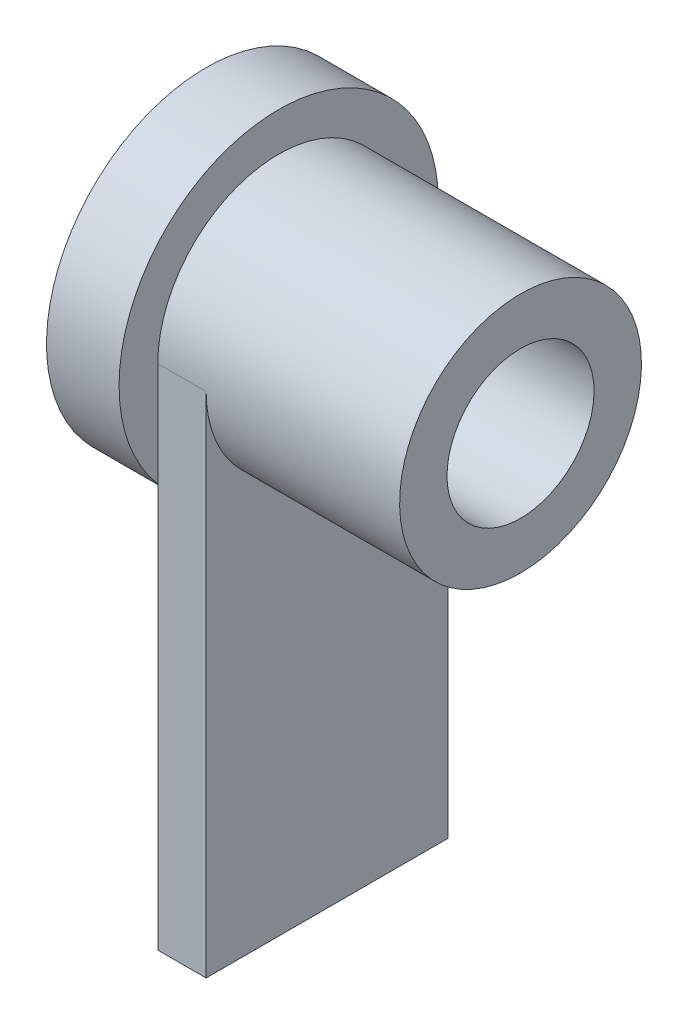
ISO-10303-21;
HEADER;
FILE_DESCRIPTION(('STEP AP214'),'2;1');
FILE_NAME('part.step','',(''),(''),'','','');
FILE_SCHEMA(('AUTOMOTIVE_DESIGN { 1 0 10303 214 1 1 1 1 }'));
ENDSEC;
DATA;
#1=APPLICATION_CONTEXT('core data for automotive mechanical design processes');
#2=APPLICATION_PROTOCOL_DEFINITION('international standard','automotive_design',2000,#1);
#3=PRODUCT_CONTEXT('',#1,'mechanical');
#4=PRODUCT('Part','Part','',(#3));
#5=PRODUCT_RELATED_PRODUCT_CATEGORY('part','',(#4));
#6=PRODUCT_DEFINITION_FORMATION('','',#4);
#7=PRODUCT_DEFINITION_CONTEXT('part definition',#1,'design');
#8=PRODUCT_DEFINITION('design','',#6,#7);
#9=PRODUCT_DEFINITION_SHAPE('','',#8);
#10=(LENGTH_UNIT() NAMED_UNIT(*) SI_UNIT(.MILLI.,.METRE.));
#11=(NAMED_UNIT(*) PLANE_ANGLE_UNIT() SI_UNIT($,.RADIAN.));
#12=(NAMED_UNIT(*) SI_UNIT($,.STERADIAN.) SOLID_ANGLE_UNIT());
#13=UNCERTAINTY_MEASURE_WITH_UNIT(LENGTH_MEASURE(1.E-05),#10,'distance_accuracy_value','');
#14=(GEOMETRIC_REPRESENTATION_CONTEXT(3) GLOBAL_UNCERTAINTY_ASSIGNED_CONTEXT((#13)) GLOBAL_UNIT_ASSIGNED_CONTEXT((#10,
#11,#12)) REPRESENTATION_CONTEXT('',''));
#15=CARTESIAN_POINT('',(0.,0.,0.));
#16=DIRECTION('',(0.,0.,1.));
#17=DIRECTION('',(1.,0.,0.));
#18=AXIS2_PLACEMENT_3D('',#15,#16,#17);
#19=CARTESIAN_POINT('',(0.,0.,15.875));
#20=DIRECTION('',(1.,0.,0.));
#21=DIRECTION('',(0.,1.,0.));
#22=AXIS2_PLACEMENT_3D('',#19,#20,#21);
#23=PLANE('',#22);
#24=CARTESIAN_POINT('',(0.,0.,0.));
#25=DIRECTION('',(-1.,0.,0.));
#26=DIRECTION('',(0.,-1.,0.));
#27=AXIS2_PLACEMENT_3D('',#24,#25,#26);
#28=CIRCLE('',#27,20.955);
#29=CARTESIAN_POINT('',(0.,-13.6783186101216,-15.875));
#30=VERTEX_POINT('',#29);
#31=CARTESIAN_POINT('',(0.,-13.6783186101216,15.875));
#32=VERTEX_POINT('',#31);
#33=EDGE_CURVE('E13',#30,#32,#28,.T.);
#34=ORIENTED_EDGE('',*,*,#33,.F.);
#35=DIRECTION('',(0.,-1.,0.));
#36=VECTOR('',#35,1.);
#37=CARTESIAN_POINT('',(0.,0.,-15.875));
#38=LINE('',#37,#36);
#39=CARTESIAN_POINT('',(0.,-66.675,-15.875));
#40=VERTEX_POINT('',#39);
#41=EDGE_CURVE('E148',#30,#40,#38,.T.);
#42=ORIENTED_EDGE('',*,*,#41,.T.);
#43=DIRECTION('',(0.,0.,-1.));
#44=VECTOR('',#43,1.);
#45=CARTESIAN_POINT('',(0.,-66.675,15.875));
#46=LINE('',#45,#44);
#47=CARTESIAN_POINT('',(0.,-66.675,15.875));
#48=VERTEX_POINT('',#47);
#49=EDGE_CURVE('E58',#48,#40,#46,.T.);
#50=ORIENTED_EDGE('',*,*,#49,.F.);
#51=DIRECTION('',(0.,-1.,0.));
#52=VECTOR('',#51,1.);
#53=CARTESIAN_POINT('',(0.,0.,15.875));
#54=LINE('',#53,#52);
#55=EDGE_CURVE('E111',#32,#48,#54,.T.);
#56=ORIENTED_EDGE('',*,*,#55,.F.);
#57=EDGE_LOOP('',(#34,#42,#50,#56));
#58=FACE_BOUND('',#57,.T.);
#59=ADVANCED_FACE('F55',(#58),#23,.F.);
#60=CARTESIAN_POINT('',(0.,-66.675,15.875));
#61=DIRECTION('',(0.,1.,0.));
#62=DIRECTION('',(0.,0.,1.));
#63=AXIS2_PLACEMENT_3D('',#60,#61,#62);
#64=PLANE('',#63);
#65=DIRECTION('',(1.,0.,0.));
#66=VECTOR('',#65,1.);
#67=CARTESIAN_POINT('',(0.,-66.675,-15.875));
#68=LINE('',#67,#66);
#69=CARTESIAN_POINT('',(6.35,-66.675,-15.875));
#70=VERTEX_POINT('',#69);
#71=EDGE_CURVE('E150',#40,#70,#68,.T.);
#72=ORIENTED_EDGE('',*,*,#71,.T.);
#73=DIRECTION('',(0.,0.,-1.));
#74=VECTOR('',#73,1.);
#75=CARTESIAN_POINT('',(6.35,-66.675,15.875));
#76=LINE('',#75,#74);
#77=CARTESIAN_POINT('',(6.35,-66.675,15.875));
#78=VERTEX_POINT('',#77);
#79=EDGE_CURVE('E145',#78,#70,#76,.T.);
#80=ORIENTED_EDGE('',*,*,#79,.F.);
#81=DIRECTION('',(1.,0.,0.));
#82=VECTOR('',#81,1.);
#83=CARTESIAN_POINT('',(0.,-66.675,15.875));
#84=LINE('',#83,#82);
#85=EDGE_CURVE('E116',#48,#78,#84,.T.);
#86=ORIENTED_EDGE('',*,*,#85,.F.);
#87=ORIENTED_EDGE('',*,*,#49,.T.);
#88=EDGE_LOOP('',(#72,#80,#86,#87));
#89=FACE_BOUND('',#88,.T.);
#90=ADVANCED_FACE('F155',(#89),#64,.F.);
#91=CARTESIAN_POINT('',(6.35,-66.675,15.875));
#92=DIRECTION('',(-1.,0.,0.));
#93=DIRECTION('',(0.,-1.,0.));
#94=AXIS2_PLACEMENT_3D('',#91,#92,#93);
#95=PLANE('',#94);
#96=DIRECTION('',(0.,1.,0.));
#97=VECTOR('',#96,1.);
#98=CARTESIAN_POINT('',(6.35,-66.675,-15.875));
#99=LINE('',#98,#97);
#100=CARTESIAN_POINT('',(6.35,0.,-15.875));
#101=VERTEX_POINT('',#100);
#102=EDGE_CURVE('E94',#70,#101,#99,.T.);
#103=ORIENTED_EDGE('',*,*,#102,.T.);
#104=CARTESIAN_POINT('',(6.35,0.,0.));
#105=DIRECTION('',(-1.,0.,0.));
#106=DIRECTION('',(0.,-1.,0.));
#107=AXIS2_PLACEMENT_3D('',#104,#105,#106);
#108=CIRCLE('',#107,15.875);
#109=CARTESIAN_POINT('',(6.35,0.,15.875));
#110=VERTEX_POINT('',#109);
#111=EDGE_CURVE('E78',#101,#110,#108,.T.);
#112=ORIENTED_EDGE('',*,*,#111,.T.);
#113=DIRECTION('',(0.,1.,0.));
#114=VECTOR('',#113,1.);
#115=CARTESIAN_POINT('',(6.35,-66.675,15.875));
#116=LINE('',#115,#114);
#117=EDGE_CURVE('E143',#78,#110,#116,.T.);
#118=ORIENTED_EDGE('',*,*,#117,.F.);
#119=ORIENTED_EDGE('',*,*,#79,.T.);
#120=EDGE_LOOP('',(#103,#112,#118,#119));
#121=FACE_BOUND('',#120,.T.);
#122=ADVANCED_FACE('F179',(#121),#95,.F.);
#123=CARTESIAN_POINT('',(0.,0.,15.875));
#124=DIRECTION('',(0.,0.,1.));
#125=DIRECTION('',(1.,0.,0.));
#126=AXIS2_PLACEMENT_3D('',#123,#124,#125);
#127=PLANE('',#126);
#128=DIRECTION('',(-1.,0.,0.));
#129=VECTOR('',#128,1.);
#130=CARTESIAN_POINT('',(6.35,0.,15.875));
#131=LINE('',#130,#129);
#132=CARTESIAN_POINT('',(0.,0.,15.875));
#133=VERTEX_POINT('',#132);
#134=EDGE_CURVE('E101',#110,#133,#131,.T.);
#135=ORIENTED_EDGE('',*,*,#134,.T.);
#136=EDGE_CURVE('E109',#133,#32,#54,.T.);
#137=ORIENTED_EDGE('',*,*,#136,.T.);
#138=ORIENTED_EDGE('',*,*,#55,.T.);
#139=ORIENTED_EDGE('',*,*,#85,.T.);
#140=ORIENTED_EDGE('',*,*,#117,.T.);
#141=EDGE_LOOP('',(#135,#137,#138,#139,#140));
#142=FACE_BOUND('',#141,.T.);
#143=ADVANCED_FACE('F110',(#142),#127,.T.);
#144=CARTESIAN_POINT('',(0.,0.,-15.875));
#145=DIRECTION('',(0.,0.,1.));
#146=DIRECTION('',(1.,0.,0.));
#147=AXIS2_PLACEMENT_3D('',#144,#145,#146);
#148=PLANE('',#147);
#149=DIRECTION('',(-1.,0.,0.));
#150=VECTOR('',#149,1.);
#151=CARTESIAN_POINT('',(6.35,0.,-15.875));
#152=LINE('',#151,#150);
#153=CARTESIAN_POINT('',(0.,0.,-15.875));
#154=VERTEX_POINT('',#153);
#155=EDGE_CURVE('E140',#101,#154,#152,.T.);
#156=ORIENTED_EDGE('',*,*,#155,.F.);
#157=ORIENTED_EDGE('',*,*,#102,.F.);
#158=ORIENTED_EDGE('',*,*,#71,.F.);
#159=ORIENTED_EDGE('',*,*,#41,.F.);
#160=EDGE_CURVE('E125',#154,#30,#38,.T.);
#161=ORIENTED_EDGE('',*,*,#160,.F.);
#162=EDGE_LOOP('',(#156,#157,#158,#159,#161));
#163=FACE_BOUND('',#162,.T.);
#164=ADVANCED_FACE('F157',(#163),#148,.F.);
#165=CARTESIAN_POINT('',(31.75,0.,0.));
#166=DIRECTION('',(-1.,0.,0.));
#167=DIRECTION('',(0.,-1.,0.));
#168=AXIS2_PLACEMENT_3D('',#165,#166,#167);
#169=CYLINDRICAL_SURFACE('',#168,15.875);
#170=CARTESIAN_POINT('',(31.75,0.,0.));
#171=DIRECTION('',(-1.,0.,0.));
#172=DIRECTION('',(0.,-1.,0.));
#173=AXIS2_PLACEMENT_3D('',#170,#171,#172);
#174=CIRCLE('',#173,15.875);
#175=CARTESIAN_POINT('',(31.75,-15.875,0.));
#176=VERTEX_POINT('',#175);
#177=EDGE_CURVE('E135',#176,#176,#174,.T.);
#178=ORIENTED_EDGE('',*,*,#177,.T.);
#179=EDGE_LOOP('',(#178));
#180=FACE_BOUND('',#179,.T.);
#181=ORIENTED_EDGE('',*,*,#134,.F.);
#182=ORIENTED_EDGE('',*,*,#111,.F.);
#183=ORIENTED_EDGE('',*,*,#155,.T.);
#184=CARTESIAN_POINT('',(0.,0.,0.));
#185=DIRECTION('',(-1.,0.,0.));
#186=DIRECTION('',(0.,-1.,0.));
#187=AXIS2_PLACEMENT_3D('',#184,#185,#186);
#188=CIRCLE('',#187,15.875);
#189=EDGE_CURVE('E129',#133,#154,#188,.T.);
#190=ORIENTED_EDGE('',*,*,#189,.F.);
#191=EDGE_LOOP('',(#181,#182,#183,#190));
#192=FACE_BOUND('',#191,.T.);
#193=ADVANCED_FACE('F159',(#180,#192),#169,.T.);
#194=CARTESIAN_POINT('',(31.75,0.,0.));
#195=DIRECTION('',(-1.,0.,0.));
#196=DIRECTION('',(0.,-1.,0.));
#197=AXIS2_PLACEMENT_3D('',#194,#195,#196);
#198=PLANE('',#197);
#199=CARTESIAN_POINT('',(31.75,0.,0.));
#200=DIRECTION('',(1.,0.,0.));
#201=DIRECTION('',(0.,1.,0.));
#202=AXIS2_PLACEMENT_3D('',#199,#200,#201);
#203=CIRCLE('',#202,9.65199999999999);
#204=CARTESIAN_POINT('',(31.75,9.65199999999999,0.));
#205=VERTEX_POINT('',#204);
#206=EDGE_CURVE('E273',#205,#205,#203,.T.);
#207=ORIENTED_EDGE('',*,*,#206,.F.);
#208=EDGE_LOOP('',(#207));
#209=FACE_BOUND('',#208,.T.);
#210=ORIENTED_EDGE('',*,*,#177,.F.);
#211=EDGE_LOOP('',(#210));
#212=FACE_BOUND('',#211,.T.);
#213=ADVANCED_FACE('F161',(#209,#212),#198,.F.);
#214=CARTESIAN_POINT('',(-9.525,0.,0.));
#215=DIRECTION('',(1.,0.,0.));
#216=DIRECTION('',(0.,1.,0.));
#217=AXIS2_PLACEMENT_3D('',#214,#215,#216);
#218=CYLINDRICAL_SURFACE('',#217,20.955);
#219=CARTESIAN_POINT('',(-9.525,0.,0.));
#220=DIRECTION('',(-1.,0.,0.));
#221=DIRECTION('',(0.,-1.,0.));
#222=AXIS2_PLACEMENT_3D('',#219,#220,#221);
#223=CIRCLE('',#222,20.955);
#224=CARTESIAN_POINT('',(-9.525,-20.955,0.));
#225=VERTEX_POINT('',#224);
#226=EDGE_CURVE('E126',#225,#225,#223,.T.);
#227=ORIENTED_EDGE('',*,*,#226,.F.);
#228=EDGE_LOOP('',(#227));
#229=FACE_BOUND('',#228,.T.);
#230=EDGE_CURVE('E64',#32,#30,#28,.T.);
#231=ORIENTED_EDGE('',*,*,#230,.T.);
#232=ORIENTED_EDGE('',*,*,#33,.T.);
#233=EDGE_LOOP('',(#231,#232));
#234=FACE_BOUND('',#233,.T.);
#235=ADVANCED_FACE('F122',(#229,#234),#218,.T.);
#236=CARTESIAN_POINT('',(-9.525,0.,0.));
#237=DIRECTION('',(-1.,0.,0.));
#238=DIRECTION('',(0.,-1.,0.));
#239=AXIS2_PLACEMENT_3D('',#236,#237,#238);
#240=PLANE('',#239);
#241=CARTESIAN_POINT('',(-9.52500000000001,0.,0.));
#242=DIRECTION('',(1.,0.,0.));
#243=DIRECTION('',(0.,1.,0.));
#244=AXIS2_PLACEMENT_3D('',#241,#242,#243);
#245=CIRCLE('',#244,19.1135);
#246=CARTESIAN_POINT('',(-9.52500000000001,19.1135,0.));
#247=VERTEX_POINT('',#246);
#248=EDGE_CURVE('E127',#247,#247,#245,.T.);
#249=ORIENTED_EDGE('',*,*,#248,.T.);
#250=EDGE_LOOP('',(#249));
#251=FACE_BOUND('',#250,.T.);
#252=ORIENTED_EDGE('',*,*,#226,.T.);
#253=EDGE_LOOP('',(#252));
#254=FACE_BOUND('',#253,.T.);
#255=ADVANCED_FACE('F218',(#251,#254),#240,.T.);
#256=CARTESIAN_POINT('',(0.,0.,0.));
#257=DIRECTION('',(-1.,0.,0.));
#258=DIRECTION('',(0.,-1.,0.));
#259=AXIS2_PLACEMENT_3D('',#256,#257,#258);
#260=PLANE('',#259);
#261=ORIENTED_EDGE('',*,*,#136,.F.);
#262=ORIENTED_EDGE('',*,*,#189,.T.);
#263=ORIENTED_EDGE('',*,*,#160,.T.);
#264=ORIENTED_EDGE('',*,*,#230,.F.);
#265=EDGE_LOOP('',(#261,#262,#263,#264));
#266=FACE_BOUND('',#265,.T.);
#267=ADVANCED_FACE('F124',(#266),#260,.F.);
#268=CARTESIAN_POINT('',(31.75,0.,0.));
#269=DIRECTION('',(1.,0.,0.));
#270=DIRECTION('',(0.,1.,0.));
#271=AXIS2_PLACEMENT_3D('',#268,#269,#270);
#272=CYLINDRICAL_SURFACE('',#271,19.1135);
#273=ORIENTED_EDGE('',*,*,#248,.F.);
#274=EDGE_LOOP('',(#273));
#275=FACE_BOUND('',#274,.T.);
#276=CARTESIAN_POINT('',(-6.35,0.,0.));
#277=DIRECTION('',(1.,0.,0.));
#278=DIRECTION('',(0.,1.,0.));
#279=AXIS2_PLACEMENT_3D('',#276,#277,#278);
#280=CIRCLE('',#279,19.1135);
#281=CARTESIAN_POINT('',(-6.35,19.1135,0.));
#282=VERTEX_POINT('',#281);
#283=EDGE_CURVE('E132',#282,#282,#280,.T.);
#284=ORIENTED_EDGE('',*,*,#283,.T.);
#285=EDGE_LOOP('',(#284));
#286=FACE_BOUND('',#285,.T.);
#287=ADVANCED_FACE('F236',(#275,#286),#272,.F.);
#288=CARTESIAN_POINT('',(-6.35,19.1135,0.));
#289=DIRECTION('',(1.,0.,0.));
#290=DIRECTION('',(0.,1.,0.));
#291=AXIS2_PLACEMENT_3D('',#288,#289,#290);
#292=PLANE('',#291);
#293=ORIENTED_EDGE('',*,*,#283,.F.);
#294=EDGE_LOOP('',(#293));
#295=FACE_BOUND('',#294,.T.);
#296=CARTESIAN_POINT('',(-6.35,0.,0.));
#297=DIRECTION('',(1.,0.,0.));
#298=DIRECTION('',(0.,1.,0.));
#299=AXIS2_PLACEMENT_3D('',#296,#297,#298);
#300=CIRCLE('',#299,9.65199999999999);
#301=CARTESIAN_POINT('',(-6.35,9.65199999999999,0.));
#302=VERTEX_POINT('',#301);
#303=EDGE_CURVE('E270',#302,#302,#300,.T.);
#304=ORIENTED_EDGE('',*,*,#303,.T.);
#305=EDGE_LOOP('',(#304));
#306=FACE_BOUND('',#305,.T.);
#307=ADVANCED_FACE('F244',(#295,#306),#292,.F.);
#308=CARTESIAN_POINT('',(31.75,0.,0.));
#309=DIRECTION('',(1.,0.,0.));
#310=DIRECTION('',(0.,1.,0.));
#311=AXIS2_PLACEMENT_3D('',#308,#309,#310);
#312=CYLINDRICAL_SURFACE('',#311,9.65199999999999);
#313=ORIENTED_EDGE('',*,*,#303,.F.);
#314=EDGE_LOOP('',(#313));
#315=FACE_BOUND('',#314,.T.);
#316=ORIENTED_EDGE('',*,*,#206,.T.);
#317=EDGE_LOOP('',(#316));
#318=FACE_BOUND('',#317,.T.);
#319=ADVANCED_FACE('F254',(#315,#318),#312,.F.);
#320=CLOSED_SHELL('',(#59,#90,#122,#143,#164,#193,#213,#235,#255,#267,#287,#307,#319));
#321=MANIFOLD_SOLID_BREP('B2',#320);
#322=ADVANCED_BREP_SHAPE_REPRESENTATION('',(#18,#321),#14);
#323=SHAPE_DEFINITION_REPRESENTATION(#9,#322);
ENDSEC;
END-ISO-10303-21;
